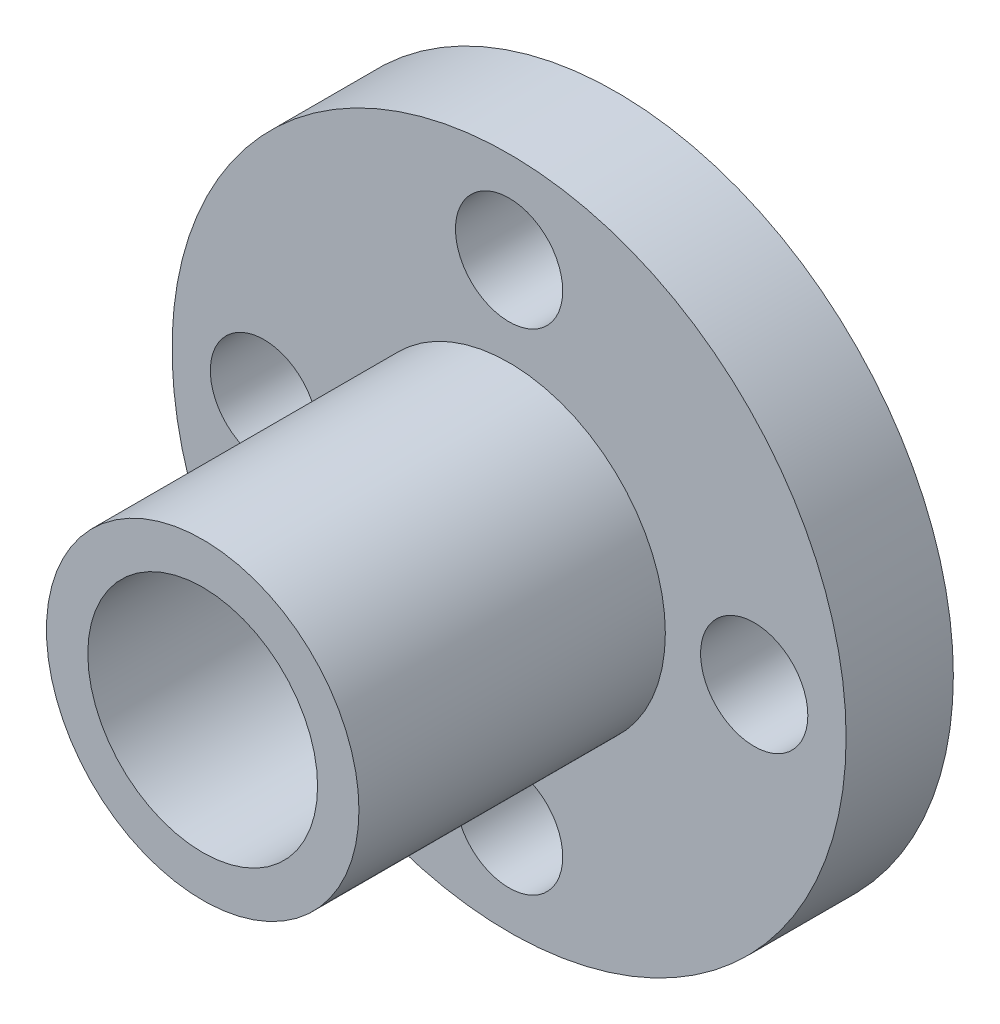
ISO-10303-21;
HEADER;
FILE_DESCRIPTION(('STEP AP214'),'2;1');
FILE_NAME('part.step','',(''),(''),'','','');
FILE_SCHEMA(('AUTOMOTIVE_DESIGN { 1 0 10303 214 1 1 1 1 }'));
ENDSEC;
DATA;
#1=APPLICATION_CONTEXT('core data for automotive mechanical design processes');
#2=APPLICATION_PROTOCOL_DEFINITION('international standard','automotive_design',2000,#1);
#3=PRODUCT_CONTEXT('',#1,'mechanical');
#4=PRODUCT('Part','Part','',(#3));
#5=PRODUCT_RELATED_PRODUCT_CATEGORY('part','',(#4));
#6=PRODUCT_DEFINITION_FORMATION('','',#4);
#7=PRODUCT_DEFINITION_CONTEXT('part definition',#1,'design');
#8=PRODUCT_DEFINITION('design','',#6,#7);
#9=PRODUCT_DEFINITION_SHAPE('','',#8);
#10=(LENGTH_UNIT() NAMED_UNIT(*) SI_UNIT(.MILLI.,.METRE.));
#11=(NAMED_UNIT(*) PLANE_ANGLE_UNIT() SI_UNIT($,.RADIAN.));
#12=(NAMED_UNIT(*) SI_UNIT($,.STERADIAN.) SOLID_ANGLE_UNIT());
#13=UNCERTAINTY_MEASURE_WITH_UNIT(LENGTH_MEASURE(1.E-05),#10,'distance_accuracy_value','');
#14=(GEOMETRIC_REPRESENTATION_CONTEXT(3) GLOBAL_UNCERTAINTY_ASSIGNED_CONTEXT((#13)) GLOBAL_UNIT_ASSIGNED_CONTEXT((#10,
#11,#12)) REPRESENTATION_CONTEXT('',''));
#15=CARTESIAN_POINT('',(0.,0.,0.));
#16=DIRECTION('',(0.,0.,1.));
#17=DIRECTION('',(1.,0.,0.));
#18=AXIS2_PLACEMENT_3D('',#15,#16,#17);
#19=CARTESIAN_POINT('',(-22.9877581894398,1.25414587091655,3.5));
#20=DIRECTION('',(0.,0.,-1.));
#21=DIRECTION('',(-1.,0.,0.));
#22=AXIS2_PLACEMENT_3D('',#19,#20,#21);
#23=CYLINDRICAL_SURFACE('',#22,1.75);
#24=CARTESIAN_POINT('',(-22.9877581894398,1.25414587091655,3.5));
#25=DIRECTION('',(0.,0.,1.));
#26=DIRECTION('',(1.,0.,0.));
#27=AXIS2_PLACEMENT_3D('',#24,#25,#26);
#28=CIRCLE('',#27,1.75);
#29=CARTESIAN_POINT('',(-21.2377581894398,1.25414587091655,3.5));
#30=VERTEX_POINT('',#29);
#31=EDGE_CURVE('E56',#30,#30,#28,.T.);
#32=ORIENTED_EDGE('',*,*,#31,.T.);
#33=EDGE_LOOP('',(#32));
#34=FACE_BOUND('',#33,.T.);
#35=CARTESIAN_POINT('',(-22.9877581894398,1.25414587091655,0.));
#36=DIRECTION('',(0.,0.,1.));
#37=DIRECTION('',(1.,0.,0.));
#38=AXIS2_PLACEMENT_3D('',#35,#36,#37);
#39=CIRCLE('',#38,1.75);
#40=CARTESIAN_POINT('',(-21.2377581894398,1.25414587091655,0.));
#41=VERTEX_POINT('',#40);
#42=EDGE_CURVE('E73',#41,#41,#39,.T.);
#43=ORIENTED_EDGE('',*,*,#42,.F.);
#44=EDGE_LOOP('',(#43));
#45=FACE_BOUND('',#44,.T.);
#46=ADVANCED_FACE('F14',(#34,#45),#23,.F.);
#47=CARTESIAN_POINT('',(-38.9877581894398,1.25414587091655,3.5));
#48=DIRECTION('',(0.,0.,-1.));
#49=DIRECTION('',(-1.,0.,0.));
#50=AXIS2_PLACEMENT_3D('',#47,#48,#49);
#51=CYLINDRICAL_SURFACE('',#50,1.75);
#52=CARTESIAN_POINT('',(-38.9877581894398,1.25414587091655,3.5));
#53=DIRECTION('',(0.,0.,1.));
#54=DIRECTION('',(1.,0.,0.));
#55=AXIS2_PLACEMENT_3D('',#52,#53,#54);
#56=CIRCLE('',#55,1.75);
#57=CARTESIAN_POINT('',(-37.2377581894398,1.25414587091655,3.5));
#58=VERTEX_POINT('',#57);
#59=EDGE_CURVE('E52',#58,#58,#56,.T.);
#60=ORIENTED_EDGE('',*,*,#59,.T.);
#61=EDGE_LOOP('',(#60));
#62=FACE_BOUND('',#61,.T.);
#63=CARTESIAN_POINT('',(-38.9877581894398,1.25414587091655,0.));
#64=DIRECTION('',(0.,0.,1.));
#65=DIRECTION('',(1.,0.,0.));
#66=AXIS2_PLACEMENT_3D('',#63,#64,#65);
#67=CIRCLE('',#66,1.75);
#68=CARTESIAN_POINT('',(-37.2377581894398,1.25414587091655,0.));
#69=VERTEX_POINT('',#68);
#70=EDGE_CURVE('E70',#69,#69,#67,.T.);
#71=ORIENTED_EDGE('',*,*,#70,.F.);
#72=EDGE_LOOP('',(#71));
#73=FACE_BOUND('',#72,.T.);
#74=ADVANCED_FACE('F105',(#62,#73),#51,.F.);
#75=CARTESIAN_POINT('',(-30.9877581894398,-6.74585412908346,3.5));
#76=DIRECTION('',(0.,0.,-1.));
#77=DIRECTION('',(-1.,0.,0.));
#78=AXIS2_PLACEMENT_3D('',#75,#76,#77);
#79=CYLINDRICAL_SURFACE('',#78,1.75);
#80=CARTESIAN_POINT('',(-30.9877581894398,-6.74585412908346,3.5));
#81=DIRECTION('',(0.,0.,1.));
#82=DIRECTION('',(1.,0.,0.));
#83=AXIS2_PLACEMENT_3D('',#80,#81,#82);
#84=CIRCLE('',#83,1.75);
#85=CARTESIAN_POINT('',(-29.2377581894398,-6.74585412908346,3.5));
#86=VERTEX_POINT('',#85);
#87=EDGE_CURVE('E48',#86,#86,#84,.T.);
#88=ORIENTED_EDGE('',*,*,#87,.T.);
#89=EDGE_LOOP('',(#88));
#90=FACE_BOUND('',#89,.T.);
#91=CARTESIAN_POINT('',(-30.9877581894398,-6.74585412908346,0.));
#92=DIRECTION('',(0.,0.,1.));
#93=DIRECTION('',(1.,0.,0.));
#94=AXIS2_PLACEMENT_3D('',#91,#92,#93);
#95=CIRCLE('',#94,1.75);
#96=CARTESIAN_POINT('',(-29.2377581894398,-6.74585412908346,0.));
#97=VERTEX_POINT('',#96);
#98=EDGE_CURVE('E66',#97,#97,#95,.T.);
#99=ORIENTED_EDGE('',*,*,#98,.F.);
#100=EDGE_LOOP('',(#99));
#101=FACE_BOUND('',#100,.T.);
#102=ADVANCED_FACE('F111',(#90,#101),#79,.F.);
#103=CARTESIAN_POINT('',(-30.9877581894398,9.25414587091655,3.5));
#104=DIRECTION('',(0.,0.,-1.));
#105=DIRECTION('',(-1.,0.,0.));
#106=AXIS2_PLACEMENT_3D('',#103,#104,#105);
#107=CYLINDRICAL_SURFACE('',#106,1.75);
#108=CARTESIAN_POINT('',(-30.9877581894398,9.25414587091655,3.5));
#109=DIRECTION('',(0.,0.,1.));
#110=DIRECTION('',(1.,0.,0.));
#111=AXIS2_PLACEMENT_3D('',#108,#109,#110);
#112=CIRCLE('',#111,1.75);
#113=CARTESIAN_POINT('',(-29.2377581894398,9.25414587091655,3.5));
#114=VERTEX_POINT('',#113);
#115=EDGE_CURVE('E44',#114,#114,#112,.T.);
#116=ORIENTED_EDGE('',*,*,#115,.T.);
#117=EDGE_LOOP('',(#116));
#118=FACE_BOUND('',#117,.T.);
#119=CARTESIAN_POINT('',(-30.9877581894398,9.25414587091655,0.));
#120=DIRECTION('',(0.,0.,1.));
#121=DIRECTION('',(1.,0.,0.));
#122=AXIS2_PLACEMENT_3D('',#119,#120,#121);
#123=CIRCLE('',#122,1.75);
#124=CARTESIAN_POINT('',(-29.2377581894398,9.25414587091655,0.));
#125=VERTEX_POINT('',#124);
#126=EDGE_CURVE('E42',#125,#125,#123,.T.);
#127=ORIENTED_EDGE('',*,*,#126,.F.);
#128=EDGE_LOOP('',(#127));
#129=FACE_BOUND('',#128,.T.);
#130=ADVANCED_FACE('F16',(#118,#129),#107,.F.);
#131=CARTESIAN_POINT('',(-30.9877581894398,1.25414587091655,3.5));
#132=DIRECTION('',(0.,0.,-1.));
#133=DIRECTION('',(-1.,0.,0.));
#134=AXIS2_PLACEMENT_3D('',#131,#132,#133);
#135=CYLINDRICAL_SURFACE('',#134,11.);
#136=CARTESIAN_POINT('',(-30.9877581894398,1.25414587091655,3.5));
#137=DIRECTION('',(0.,0.,1.));
#138=DIRECTION('',(1.,0.,0.));
#139=AXIS2_PLACEMENT_3D('',#136,#137,#138);
#140=CIRCLE('',#139,11.);
#141=CARTESIAN_POINT('',(-19.9877581894398,1.25414587091655,3.5));
#142=VERTEX_POINT('',#141);
#143=EDGE_CURVE('E33',#142,#142,#140,.T.);
#144=ORIENTED_EDGE('',*,*,#143,.F.);
#145=EDGE_LOOP('',(#144));
#146=FACE_BOUND('',#145,.T.);
#147=CARTESIAN_POINT('',(-30.9877581894398,1.25414587091655,0.));
#148=DIRECTION('',(0.,0.,1.));
#149=DIRECTION('',(1.,0.,0.));
#150=AXIS2_PLACEMENT_3D('',#147,#148,#149);
#151=CIRCLE('',#150,11.);
#152=CARTESIAN_POINT('',(-19.9877581894398,1.25414587091655,0.));
#153=VERTEX_POINT('',#152);
#154=EDGE_CURVE('E18',#153,#153,#151,.T.);
#155=ORIENTED_EDGE('',*,*,#154,.T.);
#156=EDGE_LOOP('',(#155));
#157=FACE_BOUND('',#156,.T.);
#158=ADVANCED_FACE('F84',(#146,#157),#135,.T.);
#159=CARTESIAN_POINT('',(-30.9877581894398,1.25414587091655,3.5));
#160=DIRECTION('',(0.,0.,1.));
#161=DIRECTION('',(1.,0.,0.));
#162=AXIS2_PLACEMENT_3D('',#159,#160,#161);
#163=PLANE('',#162);
#164=CARTESIAN_POINT('',(-30.9877581894398,1.25414587091655,3.5));
#165=DIRECTION('',(0.,0.,1.));
#166=DIRECTION('',(1.,0.,0.));
#167=AXIS2_PLACEMENT_3D('',#164,#165,#166);
#168=CIRCLE('',#167,5.1);
#169=CARTESIAN_POINT('',(-25.8877581894398,1.25414587091655,3.5));
#170=VERTEX_POINT('',#169);
#171=EDGE_CURVE('E23',#170,#170,#168,.T.);
#172=ORIENTED_EDGE('',*,*,#171,.F.);
#173=EDGE_LOOP('',(#172));
#174=FACE_BOUND('',#173,.T.);
#175=ORIENTED_EDGE('',*,*,#115,.F.);
#176=EDGE_LOOP('',(#175));
#177=FACE_BOUND('',#176,.T.);
#178=ORIENTED_EDGE('',*,*,#87,.F.);
#179=EDGE_LOOP('',(#178));
#180=FACE_BOUND('',#179,.T.);
#181=ORIENTED_EDGE('',*,*,#59,.F.);
#182=EDGE_LOOP('',(#181));
#183=FACE_BOUND('',#182,.T.);
#184=ORIENTED_EDGE('',*,*,#31,.F.);
#185=EDGE_LOOP('',(#184));
#186=FACE_BOUND('',#185,.T.);
#187=ORIENTED_EDGE('',*,*,#143,.T.);
#188=EDGE_LOOP('',(#187));
#189=FACE_BOUND('',#188,.T.);
#190=ADVANCED_FACE('F89',(#174,#177,#180,#183,#186,#189),#163,.T.);
#191=CARTESIAN_POINT('',(-30.9877581894398,1.25414587091655,0.));
#192=DIRECTION('',(0.,0.,1.));
#193=DIRECTION('',(1.,0.,0.));
#194=AXIS2_PLACEMENT_3D('',#191,#192,#193);
#195=PLANE('',#194);
#196=CARTESIAN_POINT('',(-30.9877581894398,1.25414587091655,0.));
#197=DIRECTION('',(0.,0.,-1.));
#198=DIRECTION('',(1.,0.,0.));
#199=AXIS2_PLACEMENT_3D('',#196,#197,#198);
#200=CIRCLE('',#199,5.1);
#201=CARTESIAN_POINT('',(-25.8877581894398,1.25414587091655,0.));
#202=VERTEX_POINT('',#201);
#203=EDGE_CURVE('E10',#202,#202,#200,.T.);
#204=ORIENTED_EDGE('',*,*,#203,.F.);
#205=EDGE_LOOP('',(#204));
#206=FACE_BOUND('',#205,.T.);
#207=ORIENTED_EDGE('',*,*,#126,.T.);
#208=EDGE_LOOP('',(#207));
#209=FACE_BOUND('',#208,.T.);
#210=ORIENTED_EDGE('',*,*,#98,.T.);
#211=EDGE_LOOP('',(#210));
#212=FACE_BOUND('',#211,.T.);
#213=ORIENTED_EDGE('',*,*,#70,.T.);
#214=EDGE_LOOP('',(#213));
#215=FACE_BOUND('',#214,.T.);
#216=ORIENTED_EDGE('',*,*,#42,.T.);
#217=EDGE_LOOP('',(#216));
#218=FACE_BOUND('',#217,.T.);
#219=ORIENTED_EDGE('',*,*,#154,.F.);
#220=EDGE_LOOP('',(#219));
#221=FACE_BOUND('',#220,.T.);
#222=ADVANCED_FACE('F86',(#206,#209,#212,#215,#218,#221),#195,.F.);
#223=CARTESIAN_POINT('',(-30.9877581894398,1.25414587091655,13.5));
#224=DIRECTION('',(0.,0.,-1.));
#225=DIRECTION('',(-1.,0.,0.));
#226=AXIS2_PLACEMENT_3D('',#223,#224,#225);
#227=CYLINDRICAL_SURFACE('',#226,5.1);
#228=CARTESIAN_POINT('',(-30.9877581894398,1.25414587091655,13.5));
#229=DIRECTION('',(0.,0.,1.));
#230=DIRECTION('',(1.,0.,0.));
#231=AXIS2_PLACEMENT_3D('',#228,#229,#230);
#232=CIRCLE('',#231,5.1);
#233=CARTESIAN_POINT('',(-25.8877581894398,1.25414587091655,13.5));
#234=VERTEX_POINT('',#233);
#235=EDGE_CURVE('E39',#234,#234,#232,.T.);
#236=ORIENTED_EDGE('',*,*,#235,.F.);
#237=EDGE_LOOP('',(#236));
#238=FACE_BOUND('',#237,.T.);
#239=ORIENTED_EDGE('',*,*,#171,.T.);
#240=EDGE_LOOP('',(#239));
#241=FACE_BOUND('',#240,.T.);
#242=ADVANCED_FACE('F88',(#238,#241),#227,.T.);
#243=CARTESIAN_POINT('',(-30.9877581894398,1.25414587091655,13.5));
#244=DIRECTION('',(0.,0.,1.));
#245=DIRECTION('',(1.,0.,0.));
#246=AXIS2_PLACEMENT_3D('',#243,#244,#245);
#247=PLANE('',#246);
#248=CARTESIAN_POINT('',(-30.9877581894398,1.25414587091655,13.5000000000218));
#249=DIRECTION('',(0.,0.,1.));
#250=DIRECTION('',(1.,0.,0.));
#251=AXIS2_PLACEMENT_3D('',#248,#249,#250);
#252=CIRCLE('',#251,3.75);
#253=CARTESIAN_POINT('',(-27.2377581894398,1.25414587091655,13.5000000000218));
#254=VERTEX_POINT('',#253);
#255=EDGE_CURVE('E222',#254,#254,#252,.F.);
#256=ORIENTED_EDGE('',*,*,#255,.T.);
#257=EDGE_LOOP('',(#256));
#258=FACE_BOUND('',#257,.T.);
#259=ORIENTED_EDGE('',*,*,#235,.T.);
#260=EDGE_LOOP('',(#259));
#261=FACE_BOUND('',#260,.T.);
#262=ADVANCED_FACE('F97',(#258,#261),#247,.T.);
#263=CARTESIAN_POINT('',(-30.9877581894398,1.25414587091655,-1.5));
#264=DIRECTION('',(0.,0.,1.));
#265=DIRECTION('',(1.,0.,0.));
#266=AXIS2_PLACEMENT_3D('',#263,#264,#265);
#267=CYLINDRICAL_SURFACE('',#266,5.1);
#268=CARTESIAN_POINT('',(-30.9877581894398,1.25414587091655,-1.5));
#269=DIRECTION('',(0.,0.,-1.));
#270=DIRECTION('',(1.,0.,0.));
#271=AXIS2_PLACEMENT_3D('',#268,#269,#270);
#272=CIRCLE('',#271,5.1);
#273=CARTESIAN_POINT('',(-25.8877581894398,1.25414587091655,-1.5));
#274=VERTEX_POINT('',#273);
#275=EDGE_CURVE('E37',#274,#274,#272,.T.);
#276=ORIENTED_EDGE('',*,*,#275,.F.);
#277=EDGE_LOOP('',(#276));
#278=FACE_BOUND('',#277,.T.);
#279=ORIENTED_EDGE('',*,*,#203,.T.);
#280=EDGE_LOOP('',(#279));
#281=FACE_BOUND('',#280,.T.);
#282=ADVANCED_FACE('F174',(#278,#281),#267,.T.);
#283=CARTESIAN_POINT('',(-30.9877581894398,1.25414587091655,-1.5));
#284=DIRECTION('',(0.,0.,-1.));
#285=DIRECTION('',(1.,0.,0.));
#286=AXIS2_PLACEMENT_3D('',#283,#284,#285);
#287=PLANE('',#286);
#288=CARTESIAN_POINT('',(-30.9877581894398,1.25414587091655,-1.5));
#289=DIRECTION('',(0.,0.,-1.));
#290=DIRECTION('',(1.,0.,0.));
#291=AXIS2_PLACEMENT_3D('',#288,#289,#290);
#292=CIRCLE('',#291,3.75);
#293=CARTESIAN_POINT('',(-27.2377581894398,1.25414587091655,-1.5));
#294=VERTEX_POINT('',#293);
#295=EDGE_CURVE('E216',#294,#294,#292,.T.);
#296=ORIENTED_EDGE('',*,*,#295,.F.);
#297=EDGE_LOOP('',(#296));
#298=FACE_BOUND('',#297,.T.);
#299=ORIENTED_EDGE('',*,*,#275,.T.);
#300=EDGE_LOOP('',(#299));
#301=FACE_BOUND('',#300,.T.);
#302=ADVANCED_FACE('F185',(#298,#301),#287,.T.);
#303=CARTESIAN_POINT('',(-30.9877581894398,1.25414587091655,500000.));
#304=DIRECTION('',(0.,0.,-1.));
#305=DIRECTION('',(-1.,0.,0.));
#306=AXIS2_PLACEMENT_3D('',#303,#304,#305);
#307=CYLINDRICAL_SURFACE('',#306,3.75);
#308=ORIENTED_EDGE('',*,*,#295,.T.);
#309=EDGE_LOOP('',(#308));
#310=FACE_BOUND('',#309,.T.);
#311=ORIENTED_EDGE('',*,*,#255,.F.);
#312=EDGE_LOOP('',(#311));
#313=FACE_BOUND('',#312,.T.);
#314=ADVANCED_FACE('F196',(#310,#313),#307,.F.);
#315=CLOSED_SHELL('',(#46,#74,#102,#130,#158,#190,#222,#242,#262,#282,#302,#314));
#316=MANIFOLD_SOLID_BREP('B1',#315);
#317=ADVANCED_BREP_SHAPE_REPRESENTATION('',(#18,#316),#14);
#318=SHAPE_DEFINITION_REPRESENTATION(#9,#317);
ENDSEC;
END-ISO-10303-21;
